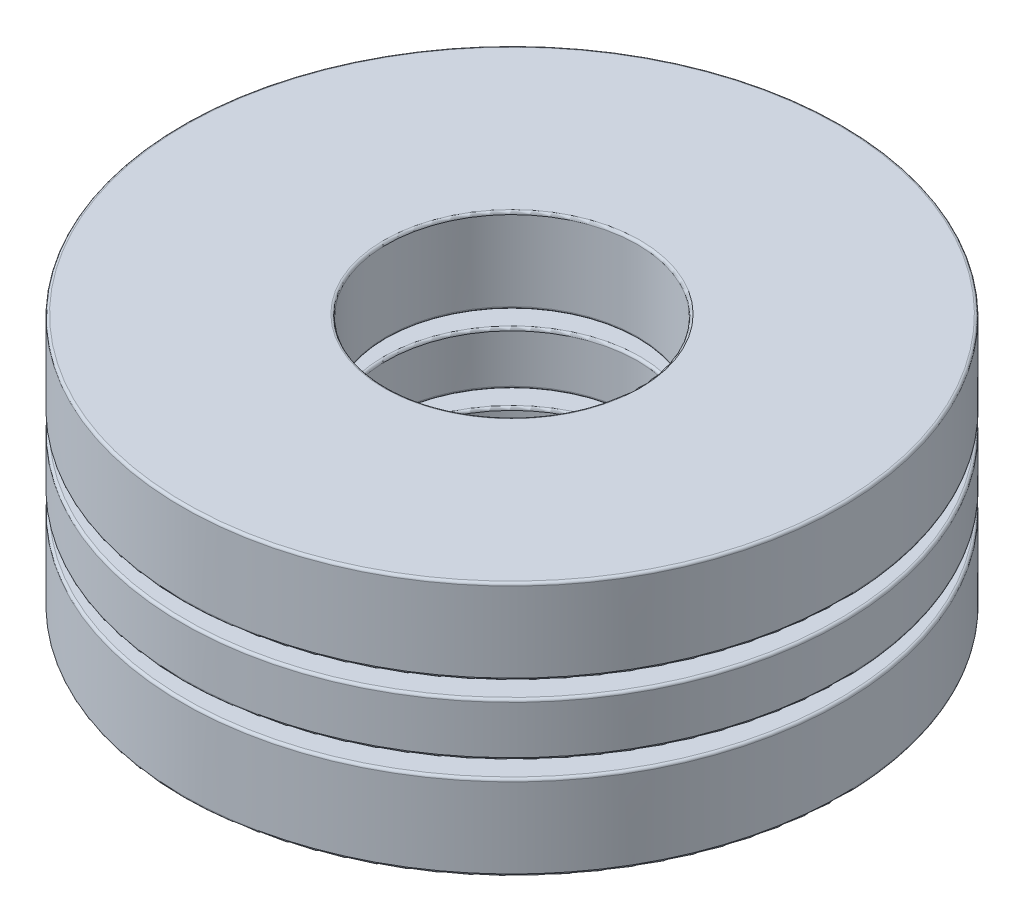
ISO-10303-21;
HEADER;
FILE_DESCRIPTION(('STEP AP214'),'2;1');
FILE_NAME('part.step','',(''),(''),'','','');
FILE_SCHEMA(('AUTOMOTIVE_DESIGN { 1 0 10303 214 1 1 1 1 }'));
ENDSEC;
DATA;
#1=APPLICATION_CONTEXT('core data for automotive mechanical design processes');
#2=APPLICATION_PROTOCOL_DEFINITION('international standard','automotive_design',2000,#1);
#3=PRODUCT_CONTEXT('',#1,'mechanical');
#4=PRODUCT('Part','Part','',(#3));
#5=PRODUCT_RELATED_PRODUCT_CATEGORY('part','',(#4));
#6=PRODUCT_DEFINITION_FORMATION('','',#4);
#7=PRODUCT_DEFINITION_CONTEXT('part definition',#1,'design');
#8=PRODUCT_DEFINITION('design','',#6,#7);
#9=PRODUCT_DEFINITION_SHAPE('','',#8);
#10=(LENGTH_UNIT() NAMED_UNIT(*) SI_UNIT(.MILLI.,.METRE.));
#11=(NAMED_UNIT(*) PLANE_ANGLE_UNIT() SI_UNIT($,.RADIAN.));
#12=(NAMED_UNIT(*) SI_UNIT($,.STERADIAN.) SOLID_ANGLE_UNIT());
#13=UNCERTAINTY_MEASURE_WITH_UNIT(LENGTH_MEASURE(1.E-05),#10,'distance_accuracy_value','');
#14=(GEOMETRIC_REPRESENTATION_CONTEXT(3) GLOBAL_UNCERTAINTY_ASSIGNED_CONTEXT((#13)) GLOBAL_UNIT_ASSIGNED_CONTEXT((#10,
#11,#12)) REPRESENTATION_CONTEXT('',''));
#15=CARTESIAN_POINT('',(0.,0.,0.));
#16=DIRECTION('',(0.,0.,1.));
#17=DIRECTION('',(1.,0.,0.));
#18=AXIS2_PLACEMENT_3D('',#15,#16,#17);
#19=CARTESIAN_POINT('',(0.,-2.4511,0.));
#20=DIRECTION('',(0.,-1.,0.));
#21=DIRECTION('',(0.,0.,-1.));
#22=AXIS2_PLACEMENT_3D('',#19,#20,#21);
#23=CYLINDRICAL_SURFACE('',#22,6.35);
#24=CARTESIAN_POINT('',(0.,-2.402078,0.));
#25=DIRECTION('',(0.,1.,0.));
#26=DIRECTION('',(0.,0.,1.));
#27=AXIS2_PLACEMENT_3D('',#24,#25,#26);
#28=CIRCLE('',#27,6.35);
#29=CARTESIAN_POINT('',(0.,-2.402078,6.35));
#30=VERTEX_POINT('',#29);
#31=EDGE_CURVE('E11',#30,#30,#28,.T.);
#32=ORIENTED_EDGE('',*,*,#31,.T.);
#33=EDGE_LOOP('',(#32));
#34=FACE_BOUND('',#33,.T.);
#35=CARTESIAN_POINT('',(0.,-0.866055333333333,0.));
#36=DIRECTION('',(0.,-1.,0.));
#37=DIRECTION('',(0.,0.,-1.));
#38=AXIS2_PLACEMENT_3D('',#35,#36,#37);
#39=CIRCLE('',#38,6.35);
#40=CARTESIAN_POINT('',(0.,-0.866055333333333,-6.35));
#41=VERTEX_POINT('',#40);
#42=EDGE_CURVE('E48',#41,#41,#39,.T.);
#43=ORIENTED_EDGE('',*,*,#42,.T.);
#44=EDGE_LOOP('',(#43));
#45=FACE_BOUND('',#44,.T.);
#46=ADVANCED_FACE('F41',(#34,#45),#23,.T.);
#47=CARTESIAN_POINT('',(0.,-0.817033333333333,6.35));
#48=DIRECTION('',(0.,-1.,0.));
#49=DIRECTION('',(0.,0.,-1.));
#50=AXIS2_PLACEMENT_3D('',#47,#48,#49);
#51=PLANE('',#50);
#52=CARTESIAN_POINT('',(0.,-0.817033333333333,0.));
#53=DIRECTION('',(0.,-1.,0.));
#54=DIRECTION('',(0.,0.,-1.));
#55=AXIS2_PLACEMENT_3D('',#52,#53,#54);
#56=CIRCLE('',#55,2.468372);
#57=CARTESIAN_POINT('',(0.,-0.817033333333333,-2.468372));
#58=VERTEX_POINT('',#57);
#59=EDGE_CURVE('E52',#58,#58,#56,.T.);
#60=ORIENTED_EDGE('',*,*,#59,.T.);
#61=EDGE_LOOP('',(#60));
#62=FACE_BOUND('',#61,.T.);
#63=CARTESIAN_POINT('',(0.,-0.817033333333333,0.));
#64=DIRECTION('',(0.,-1.,0.));
#65=DIRECTION('',(0.,0.,-1.));
#66=AXIS2_PLACEMENT_3D('',#63,#64,#65);
#67=CIRCLE('',#66,6.300978);
#68=CARTESIAN_POINT('',(0.,-0.817033333333333,-6.300978));
#69=VERTEX_POINT('',#68);
#70=EDGE_CURVE('E56',#69,#69,#67,.F.);
#71=ORIENTED_EDGE('',*,*,#70,.T.);
#72=EDGE_LOOP('',(#71));
#73=FACE_BOUND('',#72,.T.);
#74=ADVANCED_FACE('F84',(#62,#73),#51,.F.);
#75=CARTESIAN_POINT('',(0.,-2.4511,0.));
#76=DIRECTION('',(0.,-1.,0.));
#77=DIRECTION('',(0.,0.,-1.));
#78=AXIS2_PLACEMENT_3D('',#75,#76,#77);
#79=CYLINDRICAL_SURFACE('',#78,2.41935);
#80=CARTESIAN_POINT('',(0.,-2.402078,0.));
#81=DIRECTION('',(0.,1.,0.));
#82=DIRECTION('',(0.,0.,1.));
#83=AXIS2_PLACEMENT_3D('',#80,#81,#82);
#84=CIRCLE('',#83,2.41935);
#85=CARTESIAN_POINT('',(0.,-2.402078,2.41935));
#86=VERTEX_POINT('',#85);
#87=EDGE_CURVE('E67',#86,#86,#84,.F.);
#88=ORIENTED_EDGE('',*,*,#87,.T.);
#89=EDGE_LOOP('',(#88));
#90=FACE_BOUND('',#89,.T.);
#91=CARTESIAN_POINT('',(0.,-0.866055333333333,0.));
#92=DIRECTION('',(0.,-1.,0.));
#93=DIRECTION('',(0.,0.,-1.));
#94=AXIS2_PLACEMENT_3D('',#91,#92,#93);
#95=CIRCLE('',#94,2.41935);
#96=CARTESIAN_POINT('',(0.,-0.866055333333333,-2.41935));
#97=VERTEX_POINT('',#96);
#98=EDGE_CURVE('E70',#97,#97,#95,.F.);
#99=ORIENTED_EDGE('',*,*,#98,.T.);
#100=EDGE_LOOP('',(#99));
#101=FACE_BOUND('',#100,.T.);
#102=ADVANCED_FACE('F74',(#90,#101),#79,.F.);
#103=CARTESIAN_POINT('',(0.,-2.4511,6.35));
#104=DIRECTION('',(0.,1.,0.));
#105=DIRECTION('',(0.,0.,1.));
#106=AXIS2_PLACEMENT_3D('',#103,#104,#105);
#107=PLANE('',#106);
#108=CARTESIAN_POINT('',(0.,-2.4511,0.));
#109=DIRECTION('',(0.,1.,0.));
#110=DIRECTION('',(0.,0.,1.));
#111=AXIS2_PLACEMENT_3D('',#108,#109,#110);
#112=CIRCLE('',#111,2.468372);
#113=CARTESIAN_POINT('',(0.,-2.4511,2.468372));
#114=VERTEX_POINT('',#113);
#115=EDGE_CURVE('E61',#114,#114,#112,.T.);
#116=ORIENTED_EDGE('',*,*,#115,.T.);
#117=EDGE_LOOP('',(#116));
#118=FACE_BOUND('',#117,.T.);
#119=CARTESIAN_POINT('',(0.,-2.4511,0.));
#120=DIRECTION('',(0.,1.,0.));
#121=DIRECTION('',(0.,0.,1.));
#122=AXIS2_PLACEMENT_3D('',#119,#120,#121);
#123=CIRCLE('',#122,6.300978);
#124=CARTESIAN_POINT('',(0.,-2.4511,6.300978));
#125=VERTEX_POINT('',#124);
#126=EDGE_CURVE('E64',#125,#125,#123,.F.);
#127=ORIENTED_EDGE('',*,*,#126,.T.);
#128=EDGE_LOOP('',(#127));
#129=FACE_BOUND('',#128,.T.);
#130=ADVANCED_FACE('F103',(#118,#129),#107,.F.);
#131=CARTESIAN_POINT('',(0.,-2.402078,0.));
#132=DIRECTION('',(0.,1.,0.));
#133=DIRECTION('',(0.,0.,1.));
#134=AXIS2_PLACEMENT_3D('',#131,#132,#133);
#135=TOROIDAL_SURFACE('',#134,2.468372,0.049022);
#136=ORIENTED_EDGE('',*,*,#115,.F.);
#137=EDGE_LOOP('',(#136));
#138=FACE_BOUND('',#137,.T.);
#139=ORIENTED_EDGE('',*,*,#87,.F.);
#140=EDGE_LOOP('',(#139));
#141=FACE_BOUND('',#140,.T.);
#142=ADVANCED_FACE('F80',(#138,#141),#135,.T.);
#143=CARTESIAN_POINT('',(0.,-0.866055333333333,0.));
#144=DIRECTION('',(0.,-1.,0.));
#145=DIRECTION('',(0.,0.,-1.));
#146=AXIS2_PLACEMENT_3D('',#143,#144,#145);
#147=TOROIDAL_SURFACE('',#146,2.468372,0.049022);
#148=ORIENTED_EDGE('',*,*,#98,.F.);
#149=EDGE_LOOP('',(#148));
#150=FACE_BOUND('',#149,.T.);
#151=ORIENTED_EDGE('',*,*,#59,.F.);
#152=EDGE_LOOP('',(#151));
#153=FACE_BOUND('',#152,.T.);
#154=ADVANCED_FACE('F76',(#150,#153),#147,.T.);
#155=CARTESIAN_POINT('',(0.,-2.402078,0.));
#156=DIRECTION('',(0.,1.,0.));
#157=DIRECTION('',(0.,0.,1.));
#158=AXIS2_PLACEMENT_3D('',#155,#156,#157);
#159=TOROIDAL_SURFACE('',#158,6.300978,0.049022);
#160=ORIENTED_EDGE('',*,*,#31,.F.);
#161=EDGE_LOOP('',(#160));
#162=FACE_BOUND('',#161,.T.);
#163=ORIENTED_EDGE('',*,*,#126,.F.);
#164=EDGE_LOOP('',(#163));
#165=FACE_BOUND('',#164,.T.);
#166=ADVANCED_FACE('F79',(#162,#165),#159,.T.);
#167=CARTESIAN_POINT('',(0.,-0.866055333333333,0.));
#168=DIRECTION('',(0.,-1.,0.));
#169=DIRECTION('',(0.,0.,-1.));
#170=AXIS2_PLACEMENT_3D('',#167,#168,#169);
#171=TOROIDAL_SURFACE('',#170,6.300978,0.049022);
#172=ORIENTED_EDGE('',*,*,#70,.F.);
#173=EDGE_LOOP('',(#172));
#174=FACE_BOUND('',#173,.T.);
#175=ORIENTED_EDGE('',*,*,#42,.F.);
#176=EDGE_LOOP('',(#175));
#177=FACE_BOUND('',#176,.T.);
#178=ADVANCED_FACE('F43',(#174,#177),#171,.T.);
#179=CLOSED_SHELL('',(#46,#74,#102,#130,#142,#154,#166,#178));
#180=MANIFOLD_SOLID_BREP('B2',#179);
#181=CARTESIAN_POINT('',(0.,-2.4511,0.));
#182=DIRECTION('',(0.,-1.,0.));
#183=DIRECTION('',(0.,0.,-1.));
#184=AXIS2_PLACEMENT_3D('',#181,#182,#183);
#185=CYLINDRICAL_SURFACE('',#184,6.35);
#186=CARTESIAN_POINT('',(0.,0.866055333333334,0.));
#187=DIRECTION('',(0.,1.,0.));
#188=DIRECTION('',(0.,0.,1.));
#189=AXIS2_PLACEMENT_3D('',#186,#187,#188);
#190=CIRCLE('',#189,6.35);
#191=CARTESIAN_POINT('',(0.,0.866055333333334,6.35));
#192=VERTEX_POINT('',#191);
#193=EDGE_CURVE('E40',#192,#192,#190,.T.);
#194=ORIENTED_EDGE('',*,*,#193,.T.);
#195=EDGE_LOOP('',(#194));
#196=FACE_BOUND('',#195,.T.);
#197=CARTESIAN_POINT('',(0.,2.402078,0.));
#198=DIRECTION('',(0.,-1.,0.));
#199=DIRECTION('',(0.,0.,-1.));
#200=AXIS2_PLACEMENT_3D('',#197,#198,#199);
#201=CIRCLE('',#200,6.35);
#202=CARTESIAN_POINT('',(0.,2.402078,-6.35));
#203=VERTEX_POINT('',#202);
#204=EDGE_CURVE('E175',#203,#203,#201,.T.);
#205=ORIENTED_EDGE('',*,*,#204,.T.);
#206=EDGE_LOOP('',(#205));
#207=FACE_BOUND('',#206,.T.);
#208=ADVANCED_FACE('F168',(#196,#207),#185,.T.);
#209=CARTESIAN_POINT('',(0.,2.4511,6.35));
#210=DIRECTION('',(0.,-1.,0.));
#211=DIRECTION('',(0.,0.,-1.));
#212=AXIS2_PLACEMENT_3D('',#209,#210,#211);
#213=PLANE('',#212);
#214=CARTESIAN_POINT('',(0.,2.4511,0.));
#215=DIRECTION('',(0.,-1.,0.));
#216=DIRECTION('',(0.,0.,-1.));
#217=AXIS2_PLACEMENT_3D('',#214,#215,#216);
#218=CIRCLE('',#217,2.468372);
#219=CARTESIAN_POINT('',(0.,2.4511,-2.468372));
#220=VERTEX_POINT('',#219);
#221=EDGE_CURVE('E179',#220,#220,#218,.T.);
#222=ORIENTED_EDGE('',*,*,#221,.T.);
#223=EDGE_LOOP('',(#222));
#224=FACE_BOUND('',#223,.T.);
#225=CARTESIAN_POINT('',(0.,2.4511,0.));
#226=DIRECTION('',(0.,-1.,0.));
#227=DIRECTION('',(0.,0.,-1.));
#228=AXIS2_PLACEMENT_3D('',#225,#226,#227);
#229=CIRCLE('',#228,6.300978);
#230=CARTESIAN_POINT('',(0.,2.4511,-6.300978));
#231=VERTEX_POINT('',#230);
#232=EDGE_CURVE('E183',#231,#231,#229,.F.);
#233=ORIENTED_EDGE('',*,*,#232,.T.);
#234=EDGE_LOOP('',(#233));
#235=FACE_BOUND('',#234,.T.);
#236=ADVANCED_FACE('F211',(#224,#235),#213,.F.);
#237=CARTESIAN_POINT('',(0.,-2.4511,0.));
#238=DIRECTION('',(0.,-1.,0.));
#239=DIRECTION('',(0.,0.,-1.));
#240=AXIS2_PLACEMENT_3D('',#237,#238,#239);
#241=CYLINDRICAL_SURFACE('',#240,2.41935);
#242=CARTESIAN_POINT('',(0.,0.866055333333334,0.));
#243=DIRECTION('',(0.,1.,0.));
#244=DIRECTION('',(0.,0.,1.));
#245=AXIS2_PLACEMENT_3D('',#242,#243,#244);
#246=CIRCLE('',#245,2.41935);
#247=CARTESIAN_POINT('',(0.,0.866055333333334,2.41935));
#248=VERTEX_POINT('',#247);
#249=EDGE_CURVE('E194',#248,#248,#246,.F.);
#250=ORIENTED_EDGE('',*,*,#249,.T.);
#251=EDGE_LOOP('',(#250));
#252=FACE_BOUND('',#251,.T.);
#253=CARTESIAN_POINT('',(0.,2.402078,0.));
#254=DIRECTION('',(0.,-1.,0.));
#255=DIRECTION('',(0.,0.,-1.));
#256=AXIS2_PLACEMENT_3D('',#253,#254,#255);
#257=CIRCLE('',#256,2.41935);
#258=CARTESIAN_POINT('',(0.,2.402078,-2.41935));
#259=VERTEX_POINT('',#258);
#260=EDGE_CURVE('E197',#259,#259,#257,.F.);
#261=ORIENTED_EDGE('',*,*,#260,.T.);
#262=EDGE_LOOP('',(#261));
#263=FACE_BOUND('',#262,.T.);
#264=ADVANCED_FACE('F201',(#252,#263),#241,.F.);
#265=CARTESIAN_POINT('',(0.,0.817033333333334,6.35));
#266=DIRECTION('',(0.,1.,0.));
#267=DIRECTION('',(0.,0.,1.));
#268=AXIS2_PLACEMENT_3D('',#265,#266,#267);
#269=PLANE('',#268);
#270=CARTESIAN_POINT('',(0.,0.817033333333334,0.));
#271=DIRECTION('',(0.,1.,0.));
#272=DIRECTION('',(0.,0.,1.));
#273=AXIS2_PLACEMENT_3D('',#270,#271,#272);
#274=CIRCLE('',#273,2.468372);
#275=CARTESIAN_POINT('',(0.,0.817033333333334,2.468372));
#276=VERTEX_POINT('',#275);
#277=EDGE_CURVE('E188',#276,#276,#274,.T.);
#278=ORIENTED_EDGE('',*,*,#277,.T.);
#279=EDGE_LOOP('',(#278));
#280=FACE_BOUND('',#279,.T.);
#281=CARTESIAN_POINT('',(0.,0.817033333333334,0.));
#282=DIRECTION('',(0.,1.,0.));
#283=DIRECTION('',(0.,0.,1.));
#284=AXIS2_PLACEMENT_3D('',#281,#282,#283);
#285=CIRCLE('',#284,6.300978);
#286=CARTESIAN_POINT('',(0.,0.817033333333334,6.300978));
#287=VERTEX_POINT('',#286);
#288=EDGE_CURVE('E191',#287,#287,#285,.F.);
#289=ORIENTED_EDGE('',*,*,#288,.T.);
#290=EDGE_LOOP('',(#289));
#291=FACE_BOUND('',#290,.T.);
#292=ADVANCED_FACE('F230',(#280,#291),#269,.F.);
#293=CARTESIAN_POINT('',(0.,0.866055333333334,0.));
#294=DIRECTION('',(0.,1.,0.));
#295=DIRECTION('',(0.,0.,1.));
#296=AXIS2_PLACEMENT_3D('',#293,#294,#295);
#297=TOROIDAL_SURFACE('',#296,2.468372,0.049022);
#298=ORIENTED_EDGE('',*,*,#277,.F.);
#299=EDGE_LOOP('',(#298));
#300=FACE_BOUND('',#299,.T.);
#301=ORIENTED_EDGE('',*,*,#249,.F.);
#302=EDGE_LOOP('',(#301));
#303=FACE_BOUND('',#302,.T.);
#304=ADVANCED_FACE('F207',(#300,#303),#297,.T.);
#305=CARTESIAN_POINT('',(0.,2.402078,0.));
#306=DIRECTION('',(0.,-1.,0.));
#307=DIRECTION('',(0.,0.,-1.));
#308=AXIS2_PLACEMENT_3D('',#305,#306,#307);
#309=TOROIDAL_SURFACE('',#308,2.468372,0.049022);
#310=ORIENTED_EDGE('',*,*,#260,.F.);
#311=EDGE_LOOP('',(#310));
#312=FACE_BOUND('',#311,.T.);
#313=ORIENTED_EDGE('',*,*,#221,.F.);
#314=EDGE_LOOP('',(#313));
#315=FACE_BOUND('',#314,.T.);
#316=ADVANCED_FACE('F203',(#312,#315),#309,.T.);
#317=CARTESIAN_POINT('',(0.,0.866055333333334,0.));
#318=DIRECTION('',(0.,1.,0.));
#319=DIRECTION('',(0.,0.,1.));
#320=AXIS2_PLACEMENT_3D('',#317,#318,#319);
#321=TOROIDAL_SURFACE('',#320,6.300978,0.049022);
#322=ORIENTED_EDGE('',*,*,#193,.F.);
#323=EDGE_LOOP('',(#322));
#324=FACE_BOUND('',#323,.T.);
#325=ORIENTED_EDGE('',*,*,#288,.F.);
#326=EDGE_LOOP('',(#325));
#327=FACE_BOUND('',#326,.T.);
#328=ADVANCED_FACE('F206',(#324,#327),#321,.T.);
#329=CARTESIAN_POINT('',(0.,2.402078,0.));
#330=DIRECTION('',(0.,-1.,0.));
#331=DIRECTION('',(0.,0.,-1.));
#332=AXIS2_PLACEMENT_3D('',#329,#330,#331);
#333=TOROIDAL_SURFACE('',#332,6.300978,0.049022);
#334=ORIENTED_EDGE('',*,*,#232,.F.);
#335=EDGE_LOOP('',(#334));
#336=FACE_BOUND('',#335,.T.);
#337=ORIENTED_EDGE('',*,*,#204,.F.);
#338=EDGE_LOOP('',(#337));
#339=FACE_BOUND('',#338,.T.);
#340=ADVANCED_FACE('F170',(#336,#339),#333,.T.);
#341=CLOSED_SHELL('',(#208,#236,#264,#292,#304,#316,#328,#340));
#342=MANIFOLD_SOLID_BREP('B6',#341);
#343=CARTESIAN_POINT('',(-3.79723993733855,0.,-2.19233749999996));
#344=DIRECTION('',(0.,1.,0.));
#345=DIRECTION('',(0.866025403784443,0.,0.499999999999992));
#346=AXIS2_PLACEMENT_3D('',#343,#344,#345);
#347=SPHERICAL_SURFACE('',#346,0.817033333333333);
#348=CARTESIAN_POINT('',(-3.79723993733855,0.817033333333333,-2.19233749999996));
#349=VERTEX_POINT('',#348);
#350=VERTEX_LOOP('',#349);
#351=FACE_BOUND('',#350,.T.);
#352=ADVANCED_FACE('F295',(#351),#347,.T.);
#353=CLOSED_SHELL('',(#352));
#354=MANIFOLD_SOLID_BREP('B35',#353);
#355=CARTESIAN_POINT('',(3.79723993733852,0.,-2.19233750000002));
#356=DIRECTION('',(0.,1.,0.));
#357=DIRECTION('',(-0.866025403784436,0.,0.500000000000004));
#358=AXIS2_PLACEMENT_3D('',#355,#356,#357);
#359=SPHERICAL_SURFACE('',#358,0.817033333333333);
#360=CARTESIAN_POINT('',(3.79723993733852,0.817033333333333,-2.19233750000002));
#361=VERTEX_POINT('',#360);
#362=VERTEX_LOOP('',#361);
#363=FACE_BOUND('',#362,.T.);
#364=ADVANCED_FACE('F313',(#363),#359,.T.);
#365=CLOSED_SHELL('',(#364));
#366=MANIFOLD_SOLID_BREP('B164',#365);
#367=CARTESIAN_POINT('',(0.,0.,4.384675));
#368=DIRECTION('',(0.,1.,0.));
#369=DIRECTION('',(0.,0.,-1.));
#370=AXIS2_PLACEMENT_3D('',#367,#368,#369);
#371=SPHERICAL_SURFACE('',#370,0.817033333333333);
#372=CARTESIAN_POINT('',(0.,0.817033333333333,4.384675));
#373=VERTEX_POINT('',#372);
#374=VERTEX_LOOP('',#373);
#375=FACE_BOUND('',#374,.T.);
#376=ADVANCED_FACE('F332',(#375),#371,.T.);
#377=CLOSED_SHELL('',(#376));
#378=MANIFOLD_SOLID_BREP('B291',#377);
#379=CARTESIAN_POINT('',(0.,-2.4511,0.));
#380=DIRECTION('',(0.,-1.,0.));
#381=DIRECTION('',(0.,0.,-1.));
#382=AXIS2_PLACEMENT_3D('',#379,#380,#381);
#383=CYLINDRICAL_SURFACE('',#382,6.35);
#384=CARTESIAN_POINT('',(0.,-0.461623833333335,0.));
#385=DIRECTION('',(0.,1.,0.));
#386=DIRECTION('',(0.,0.,1.));
#387=AXIS2_PLACEMENT_3D('',#384,#385,#386);
#388=CIRCLE('',#387,6.35);
#389=CARTESIAN_POINT('',(0.,-0.461623833333335,6.35));
#390=VERTEX_POINT('',#389);
#391=EDGE_CURVE('E331',#390,#390,#388,.T.);
#392=ORIENTED_EDGE('',*,*,#391,.T.);
#393=EDGE_LOOP('',(#392));
#394=FACE_BOUND('',#393,.T.);
#395=CARTESIAN_POINT('',(0.,0.461623833333332,0.));
#396=DIRECTION('',(0.,-1.,0.));
#397=DIRECTION('',(0.,0.,-1.));
#398=AXIS2_PLACEMENT_3D('',#395,#396,#397);
#399=CIRCLE('',#398,6.35);
#400=CARTESIAN_POINT('',(0.,0.461623833333332,-6.35));
#401=VERTEX_POINT('',#400);
#402=EDGE_CURVE('E351',#401,#401,#399,.T.);
#403=ORIENTED_EDGE('',*,*,#402,.T.);
#404=EDGE_LOOP('',(#403));
#405=FACE_BOUND('',#404,.T.);
#406=ADVANCED_FACE('F344',(#394,#405),#383,.T.);
#407=CARTESIAN_POINT('',(0.,-0.510645833333335,6.35));
#408=DIRECTION('',(0.,1.,0.));
#409=DIRECTION('',(0.,0.,1.));
#410=AXIS2_PLACEMENT_3D('',#407,#408,#409);
#411=PLANE('',#410);
#412=CARTESIAN_POINT('',(0.,-0.510645833333335,0.));
#413=DIRECTION('',(0.,1.,0.));
#414=DIRECTION('',(0.,0.,1.));
#415=AXIS2_PLACEMENT_3D('',#412,#413,#414);
#416=CIRCLE('',#415,2.468372);
#417=CARTESIAN_POINT('',(0.,-0.510645833333335,2.468372));
#418=VERTEX_POINT('',#417);
#419=EDGE_CURVE('E364',#418,#418,#416,.T.);
#420=ORIENTED_EDGE('',*,*,#419,.T.);
#421=EDGE_LOOP('',(#420));
#422=FACE_BOUND('',#421,.T.);
#423=CARTESIAN_POINT('',(0.,-0.510645833333335,0.));
#424=DIRECTION('',(0.,1.,0.));
#425=DIRECTION('',(0.,0.,1.));
#426=AXIS2_PLACEMENT_3D('',#423,#424,#425);
#427=CIRCLE('',#426,6.300978);
#428=CARTESIAN_POINT('',(0.,-0.510645833333335,6.300978));
#429=VERTEX_POINT('',#428);
#430=EDGE_CURVE('E367',#429,#429,#427,.F.);
#431=ORIENTED_EDGE('',*,*,#430,.T.);
#432=EDGE_LOOP('',(#431));
#433=FACE_BOUND('',#432,.T.);
#434=CARTESIAN_POINT('',(-3.79723993733855,-0.510645833333335,-2.19233749999996));
#435=DIRECTION('',(0.,1.,0.));
#436=DIRECTION('',(-0.866025403784443,0.,-0.499999999999992));
#437=AXIS2_PLACEMENT_3D('',#434,#435,#436);
#438=CIRCLE('',#437,0.637796441411429);
#439=CARTESIAN_POINT('',(-3.24489201663294,-0.510645833333335,-1.87343927929426));
#440=VERTEX_POINT('',#439);
#441=EDGE_CURVE('E388',#440,#440,#438,.T.);
#442=ORIENTED_EDGE('',*,*,#441,.T.);
#443=EDGE_LOOP('',(#442));
#444=FACE_BOUND('',#443,.T.);
#445=CARTESIAN_POINT('',(3.79723993733852,-0.510645833333335,-2.19233750000002));
#446=DIRECTION('',(0.,1.,0.));
#447=DIRECTION('',(0.866025403784436,0.,-0.500000000000004));
#448=AXIS2_PLACEMENT_3D('',#445,#446,#447);
#449=CIRCLE('',#448,0.637796441411429);
#450=CARTESIAN_POINT('',(3.24489201663291,-0.510645833333335,-1.8734392792943));
#451=VERTEX_POINT('',#450);
#452=EDGE_CURVE('E380',#451,#451,#449,.T.);
#453=ORIENTED_EDGE('',*,*,#452,.T.);
#454=EDGE_LOOP('',(#453));
#455=FACE_BOUND('',#454,.T.);
#456=CARTESIAN_POINT('',(0.,-0.510645833333335,4.384675));
#457=DIRECTION('',(0.,1.,0.));
#458=DIRECTION('',(0.,0.,1.));
#459=AXIS2_PLACEMENT_3D('',#456,#457,#458);
#460=CIRCLE('',#459,0.637796441411429);
#461=CARTESIAN_POINT('',(0.,-0.510645833333335,3.74687855858857));
#462=VERTEX_POINT('',#461);
#463=EDGE_CURVE('E376',#462,#462,#460,.T.);
#464=ORIENTED_EDGE('',*,*,#463,.T.);
#465=EDGE_LOOP('',(#464));
#466=FACE_BOUND('',#465,.T.);
#467=ADVANCED_FACE('F406',(#422,#433,#444,#455,#466),#411,.F.);
#468=CARTESIAN_POINT('',(0.,-2.4511,0.));
#469=DIRECTION('',(0.,-1.,0.));
#470=DIRECTION('',(0.,0.,-1.));
#471=AXIS2_PLACEMENT_3D('',#468,#469,#470);
#472=CYLINDRICAL_SURFACE('',#471,2.41935);
#473=CARTESIAN_POINT('',(0.,-0.461623833333335,0.));
#474=DIRECTION('',(0.,1.,0.));
#475=DIRECTION('',(0.,0.,1.));
#476=AXIS2_PLACEMENT_3D('',#473,#474,#475);
#477=CIRCLE('',#476,2.41935);
#478=CARTESIAN_POINT('',(0.,-0.461623833333335,2.41935));
#479=VERTEX_POINT('',#478);
#480=EDGE_CURVE('E370',#479,#479,#477,.F.);
#481=ORIENTED_EDGE('',*,*,#480,.T.);
#482=EDGE_LOOP('',(#481));
#483=FACE_BOUND('',#482,.T.);
#484=CARTESIAN_POINT('',(0.,0.461623833333332,0.));
#485=DIRECTION('',(0.,-1.,0.));
#486=DIRECTION('',(0.,0.,-1.));
#487=AXIS2_PLACEMENT_3D('',#484,#485,#486);
#488=CIRCLE('',#487,2.41935);
#489=CARTESIAN_POINT('',(0.,0.461623833333332,-2.41935));
#490=VERTEX_POINT('',#489);
#491=EDGE_CURVE('E373',#490,#490,#488,.F.);
#492=ORIENTED_EDGE('',*,*,#491,.T.);
#493=EDGE_LOOP('',(#492));
#494=FACE_BOUND('',#493,.T.);
#495=ADVANCED_FACE('F409',(#483,#494),#472,.F.);
#496=CARTESIAN_POINT('',(0.,0.510645833333332,6.35));
#497=DIRECTION('',(0.,-1.,0.));
#498=DIRECTION('',(0.,0.,-1.));
#499=AXIS2_PLACEMENT_3D('',#496,#497,#498);
#500=PLANE('',#499);
#501=CARTESIAN_POINT('',(0.,0.510645833333332,0.));
#502=DIRECTION('',(0.,-1.,0.));
#503=DIRECTION('',(0.,0.,-1.));
#504=AXIS2_PLACEMENT_3D('',#501,#502,#503);
#505=CIRCLE('',#504,2.468372);
#506=CARTESIAN_POINT('',(0.,0.510645833333332,-2.468372));
#507=VERTEX_POINT('',#506);
#508=EDGE_CURVE('E355',#507,#507,#505,.T.);
#509=ORIENTED_EDGE('',*,*,#508,.T.);
#510=EDGE_LOOP('',(#509));
#511=FACE_BOUND('',#510,.T.);
#512=CARTESIAN_POINT('',(0.,0.510645833333332,0.));
#513=DIRECTION('',(0.,-1.,0.));
#514=DIRECTION('',(0.,0.,-1.));
#515=AXIS2_PLACEMENT_3D('',#512,#513,#514);
#516=CIRCLE('',#515,6.300978);
#517=CARTESIAN_POINT('',(0.,0.510645833333332,-6.300978));
#518=VERTEX_POINT('',#517);
#519=EDGE_CURVE('E359',#518,#518,#516,.F.);
#520=ORIENTED_EDGE('',*,*,#519,.T.);
#521=EDGE_LOOP('',(#520));
#522=FACE_BOUND('',#521,.T.);
#523=CARTESIAN_POINT('',(-3.79723993733855,0.510645833333332,-2.19233749999996));
#524=DIRECTION('',(0.,-1.,0.));
#525=DIRECTION('',(0.866025403784443,0.,0.499999999999992));
#526=AXIS2_PLACEMENT_3D('',#523,#524,#525);
#527=CIRCLE('',#526,0.637796441411431);
#528=CARTESIAN_POINT('',(-3.24489201663294,0.510645833333332,-1.87343927929425));
#529=VERTEX_POINT('',#528);
#530=EDGE_CURVE('E391',#529,#529,#527,.T.);
#531=ORIENTED_EDGE('',*,*,#530,.T.);
#532=EDGE_LOOP('',(#531));
#533=FACE_BOUND('',#532,.T.);
#534=CARTESIAN_POINT('',(3.79723993733852,0.510645833333332,-2.19233750000002));
#535=DIRECTION('',(0.,-1.,0.));
#536=DIRECTION('',(-0.866025403784436,0.,0.500000000000004));
#537=AXIS2_PLACEMENT_3D('',#534,#535,#536);
#538=CIRCLE('',#537,0.637796441411431);
#539=CARTESIAN_POINT('',(3.24489201663291,0.510645833333332,-1.8734392792943));
#540=VERTEX_POINT('',#539);
#541=EDGE_CURVE('E385',#540,#540,#538,.T.);
#542=ORIENTED_EDGE('',*,*,#541,.T.);
#543=EDGE_LOOP('',(#542));
#544=FACE_BOUND('',#543,.T.);
#545=CARTESIAN_POINT('',(0.,0.510645833333332,4.384675));
#546=DIRECTION('',(0.,-1.,0.));
#547=DIRECTION('',(0.,0.,-1.));
#548=AXIS2_PLACEMENT_3D('',#545,#546,#547);
#549=CIRCLE('',#548,0.637796441411431);
#550=CARTESIAN_POINT('',(0.,0.510645833333332,3.74687855858857));
#551=VERTEX_POINT('',#550);
#552=EDGE_CURVE('E377',#551,#551,#549,.T.);
#553=ORIENTED_EDGE('',*,*,#552,.T.);
#554=EDGE_LOOP('',(#553));
#555=FACE_BOUND('',#554,.T.);
#556=ADVANCED_FACE('F395',(#511,#522,#533,#544,#555),#500,.F.);
#557=CARTESIAN_POINT('',(0.,0.,4.384675));
#558=DIRECTION('',(0.,1.,0.));
#559=DIRECTION('',(0.,0.,-1.));
#560=AXIS2_PLACEMENT_3D('',#557,#558,#559);
#561=SPHERICAL_SURFACE('',#560,0.817033333333333);
#562=CARTESIAN_POINT('',(0.,0.510645833333332,3.74687855858857));
#563=CARTESIAN_POINT('',(0.,0.501675164998559,3.73969607738196));
#564=CARTESIAN_POINT('',(0.,0.492552783000895,3.73270310460206));
#565=CARTESIAN_POINT('',(0.,0.474021234127414,3.7191080760368));
#566=CARTESIAN_POINT('',(0.,0.464612067251597,3.71250602025143));
#567=CARTESIAN_POINT('',(0.,0.445523591069434,3.69970472581636));
#568=CARTESIAN_POINT('',(0.,0.435844281763088,3.69350548716665));
#569=CARTESIAN_POINT('',(0.,0.41623278087744,3.68152082357285));
#570=CARTESIAN_POINT('',(0.,0.406300589298138,3.67573539862875));
#571=CARTESIAN_POINT('',(0.,0.386200997553858,3.66458867230342));
#572=CARTESIAN_POINT('',(0.,0.376033597388881,3.65922737092218));
#573=CARTESIAN_POINT('',(0.,0.355481690704,3.64893843316086));
#574=CARTESIAN_POINT('',(0.,0.345097184184096,3.64401079678077));
#575=CARTESIAN_POINT('',(0.,0.324129550884321,3.63459796203054));
#576=CARTESIAN_POINT('',(0.,0.31354642410445,3.63011276366039));
#577=CARTESIAN_POINT('',(0.,0.292200390671569,3.62159278934294));
#578=CARTESIAN_POINT('',(0.,0.28143748401856,3.61755801339564));
#579=CARTESIAN_POINT('',(0.,0.259751051084057,3.60994606674576));
#580=CARTESIAN_POINT('',(0.,0.248827524802562,3.60636889604317));
#581=CARTESIAN_POINT('',(0.,0.226839298843794,3.59967852799998));
#582=CARTESIAN_POINT('',(0.,0.215774599166519,3.59656533065938));
#583=CARTESIAN_POINT('',(0.,0.193523723954283,3.5908084515037));
#584=CARTESIAN_POINT('',(0.,0.18233754841932,3.58816476968864));
#585=CARTESIAN_POINT('',(0.,0.159863635286543,3.58335162790421));
#586=CARTESIAN_POINT('',(0.,0.148575897688727,3.58118216793485));
#587=CARTESIAN_POINT('',(0.,0.125918955026379,3.57732133194664));
#588=CARTESIAN_POINT('',(0.,0.114549749961847,3.57562995592779));
#589=CARTESIAN_POINT('',(0.,0.0917501119920464,3.57272829885297));
#590=CARTESIAN_POINT('',(0.,0.0803196790867775,3.57151801779699));
#591=CARTESIAN_POINT('',(0.,0.057417934060114,3.56958070520805));
#592=CARTESIAN_POINT('',(0.,0.0459466219387196,3.56885367367509));
#593=CARTESIAN_POINT('',(0.,0.0229835398782163,3.5678841544044));
#594=CARTESIAN_POINT('',(0.,0.0114917699391074,3.56764166666667));
#595=CARTESIAN_POINT('',(0.,-0.0114917699391102,3.56764166666667));
#596=CARTESIAN_POINT('',(0.,-0.022983539878219,3.5678841544044));
#597=CARTESIAN_POINT('',(0.,-0.0459466219387223,3.56885367367509));
#598=CARTESIAN_POINT('',(0.,-0.0574179340601167,3.56958070520805));
#599=CARTESIAN_POINT('',(0.,-0.0803196790867802,3.57151801779699));
#600=CARTESIAN_POINT('',(0.,-0.0917501119920491,3.57272829885297));
#601=CARTESIAN_POINT('',(0.,-0.11454974996185,3.57562995592779));
#602=CARTESIAN_POINT('',(0.,-0.125918955026382,3.57732133194665));
#603=CARTESIAN_POINT('',(0.,-0.14857589768873,3.58118216793485));
#604=CARTESIAN_POINT('',(0.,-0.159863635286545,3.58335162790421));
#605=CARTESIAN_POINT('',(0.,-0.182337548419323,3.58816476968864));
#606=CARTESIAN_POINT('',(0.,-0.193523723954285,3.5908084515037));
#607=CARTESIAN_POINT('',(0.,-0.215774599166522,3.59656533065938));
#608=CARTESIAN_POINT('',(0.,-0.226839298843796,3.59967852799998));
#609=CARTESIAN_POINT('',(0.,-0.248827524802565,3.60636889604318));
#610=CARTESIAN_POINT('',(0.,-0.259751051084059,3.60994606674576));
#611=CARTESIAN_POINT('',(0.,-0.281437484018563,3.61755801339565));
#612=CARTESIAN_POINT('',(0.,-0.292200390671572,3.62159278934294));
#613=CARTESIAN_POINT('',(0.,-0.313546424104453,3.63011276366039));
#614=CARTESIAN_POINT('',(0.,-0.324129550884324,3.63459796203054));
#615=CARTESIAN_POINT('',(0.,-0.345097184184099,3.64401079678078));
#616=CARTESIAN_POINT('',(0.,-0.355481690704002,3.64893843316086));
#617=CARTESIAN_POINT('',(0.,-0.376033597388883,3.65922737092218));
#618=CARTESIAN_POINT('',(0.,-0.386200997553861,3.66458867230342));
#619=CARTESIAN_POINT('',(0.,-0.40630058929814,3.67573539862875));
#620=CARTESIAN_POINT('',(0.,-0.416232780877443,3.68152082357285));
#621=CARTESIAN_POINT('',(0.,-0.435844281763091,3.69350548716666));
#622=CARTESIAN_POINT('',(0.,-0.445523591069436,3.69970472581636));
#623=CARTESIAN_POINT('',(0.,-0.464612067251599,3.71250602025143));
#624=CARTESIAN_POINT('',(0.,-0.474021234127416,3.7191080760368));
#625=CARTESIAN_POINT('',(0.,-0.492552783000897,3.73270310460206));
#626=CARTESIAN_POINT('',(0.,-0.501675164998561,3.73969607738196));
#627=CARTESIAN_POINT('',(0.,-0.510645833333335,3.74687855858857));
#628=B_SPLINE_CURVE_WITH_KNOTS('',3,(#562,#563,#564,#565,#566,#567,#568,#569,#570,#571,#572,
#573,#574,#575,#576,#577,#578,#579,#580,#581,#582,#583,#584,#585,#586,#587,#588,#589,#590,#591,
#592,#593,#594,#595,#596,#597,#598,#599,#600,#601,#602,#603,#604,#605,#606,#607,#608,#609,#610,
#611,#612,#613,#614,#615,#616,#617,#618,#619,#620,#621,#622,#623,#624,#625,#626,#627),
.UNSPECIFIED.,.F.,.F.,(4,2,2,2,2,2,2,2,2,2,2,2,2,2,2,2,2,2,2,2,2,2,2,2,2,2,2,2,2,2,2,2,4),(0.,
0.0344727528748284,0.0689455057496566,0.103418258624485,0.137891011499313,0.172363764374141,
0.20683651724897,0.241309270123798,0.275782022998627,0.310254775873455,0.344727528748283,
0.379200281623111,0.41367303449794,0.448145787372768,0.482618540247596,0.517091293122425,
0.551564045997253,0.586036798872081,0.620509551746909,0.654982304621738,0.689455057496566,
0.723927810371394,0.758400563246223,0.792873316121051,0.827346068995879,0.861818821870707,
0.896291574745536,0.930764327620364,0.965237080495192,0.999709833370021,1.03418258624485,
1.06865533911968,1.10312809199451),.UNSPECIFIED.);
#629=EDGE_CURVE('BSEAM416',#551,#462,#628,.T.);
#630=ORIENTED_EDGE('',*,*,#552,.F.);
#631=ORIENTED_EDGE('',*,*,#463,.F.);
#632=ORIENTED_EDGE('',*,*,#629,.T.);
#633=ORIENTED_EDGE('',*,*,#629,.F.);
#634=EDGE_LOOP('',(#630,#632,#631,#633));
#635=FACE_BOUND('',#634,.T.);
#636=ADVANCED_FACE('F416',(#635),#561,.F.);
#637=CARTESIAN_POINT('',(3.79723993733852,0.,-2.19233750000002));
#638=DIRECTION('',(0.,1.,0.));
#639=DIRECTION('',(-0.866025403784436,0.,0.500000000000004));
#640=AXIS2_PLACEMENT_3D('',#637,#638,#639);
#641=SPHERICAL_SURFACE('',#640,0.817033333333333);
#642=CARTESIAN_POINT('',(3.24489201663291,0.510645833333332,-1.8734392792943));
#643=CARTESIAN_POINT('',(3.23867180544578,0.501675164998559,-1.869848038691));
#644=CARTESIAN_POINT('',(3.23261571337042,0.492552783000895,-1.86635155230105));
#645=CARTESIAN_POINT('',(3.22084207326773,0.474021234127414,-1.85955403801841));
#646=CARTESIAN_POINT('',(3.2151245252404,0.464612067251597,-1.85625301012573));
#647=CARTESIAN_POINT('',(3.2040382790583,0.445523591069434,-1.8498523629082));
#648=CARTESIAN_POINT('',(3.19866958090353,0.435844281763088,-1.84675274358334));
#649=CARTESIAN_POINT('',(3.18829055777549,0.41623278087744,-1.84076041178644));
#650=CARTESIAN_POINT('',(3.18328023280221,0.406300589298138,-1.83786769931439));
#651=CARTESIAN_POINT('',(3.17362688463544,0.386200997553858,-1.83229433615172));
#652=CARTESIAN_POINT('',(3.16898386144194,0.376033597388881,-1.8296136854611));
#653=CARTESIAN_POINT('',(3.16007337996268,0.355481690704,-1.82446921658044));
#654=CARTESIAN_POINT('',(3.15580592167692,0.345097184184096,-1.8220053983904));
#655=CARTESIAN_POINT('',(3.14765416766159,0.324129550884321,-1.81729898101529));
#656=CARTESIAN_POINT('',(3.14376987193203,0.31354642410445,-1.81505638183021));
#657=CARTESIAN_POINT('',(3.13639135773353,0.292200390671569,-1.81079639467149));
#658=CARTESIAN_POINT('',(3.13289713926459,0.28143748401856,-1.80877900669784));
#659=CARTESIAN_POINT('',(3.12630500009354,0.259751051084056,-1.8049730333729));
#660=CARTESIAN_POINT('',(3.12320707939142,0.248827524802562,-1.8031844480216));
#661=CARTESIAN_POINT('',(3.11741305070535,0.226839298843794,-1.79983926400001));
#662=CARTESIAN_POINT('',(3.11471694272139,0.215774599166519,-1.7982826653297));
#663=CARTESIAN_POINT('',(3.10973133912606,0.193523723954283,-1.79540422575187));
#664=CARTESIAN_POINT('',(3.10744184351469,0.18233754841932,-1.79408238484433));
#665=CARTESIAN_POINT('',(3.10327354045736,0.159863635286543,-1.79167581395212));
#666=CARTESIAN_POINT('',(3.1013947330114,0.148575897688727,-1.79059108396744));
#667=CARTESIAN_POINT('',(3.09805115096577,0.125918955026379,-1.78866066597334));
#668=CARTESIAN_POINT('',(3.09658637636609,0.114549749961847,-1.78781497796391));
#669=CARTESIAN_POINT('',(3.09407346762622,0.0917501119920464,-1.7863641494265));
#670=CARTESIAN_POINT('',(3.09302533348603,0.0803196790867775,-1.78575900889851));
#671=CARTESIAN_POINT('',(3.09134757156894,0.057417934060114,-1.78479035260404));
#672=CARTESIAN_POINT('',(3.09071794379204,0.0459466219387195,-1.78442683683756));
#673=CARTESIAN_POINT('',(3.08987831547416,0.0229835398782163,-1.78394207720221));
#674=CARTESIAN_POINT('',(3.08966831493318,0.0114917699391075,-1.78382083333335));
#675=CARTESIAN_POINT('',(3.08966831493318,-0.0114917699391102,-1.78382083333335));
#676=CARTESIAN_POINT('',(3.08987831547416,-0.022983539878219,-1.78394207720221));
#677=CARTESIAN_POINT('',(3.09071794379204,-0.0459466219387223,-1.78442683683756));
#678=CARTESIAN_POINT('',(3.09134757156894,-0.0574179340601168,-1.78479035260404));
#679=CARTESIAN_POINT('',(3.09302533348603,-0.0803196790867802,-1.78575900889851));
#680=CARTESIAN_POINT('',(3.09407346762622,-0.0917501119920491,-1.7863641494265));
#681=CARTESIAN_POINT('',(3.0965863763661,-0.11454974996185,-1.78781497796391));
#682=CARTESIAN_POINT('',(3.09805115096577,-0.125918955026382,-1.78866066597334));
#683=CARTESIAN_POINT('',(3.10139473301141,-0.14857589768873,-1.79059108396744));
#684=CARTESIAN_POINT('',(3.10327354045736,-0.159863635286545,-1.79167581395212));
#685=CARTESIAN_POINT('',(3.10744184351469,-0.182337548419323,-1.79408238484433));
#686=CARTESIAN_POINT('',(3.10973133912606,-0.193523723954285,-1.79540422575187));
#687=CARTESIAN_POINT('',(3.11471694272139,-0.215774599166522,-1.7982826653297));
#688=CARTESIAN_POINT('',(3.11741305070535,-0.226839298843796,-1.79983926400001));
#689=CARTESIAN_POINT('',(3.12320707939142,-0.248827524802565,-1.8031844480216));
#690=CARTESIAN_POINT('',(3.12630500009354,-0.259751051084059,-1.8049730333729));
#691=CARTESIAN_POINT('',(3.13289713926459,-0.281437484018563,-1.80877900669784));
#692=CARTESIAN_POINT('',(3.13639135773353,-0.292200390671572,-1.81079639467149));
#693=CARTESIAN_POINT('',(3.14376987193203,-0.313546424104453,-1.81505638183021));
#694=CARTESIAN_POINT('',(3.14765416766159,-0.324129550884324,-1.81729898101529));
#695=CARTESIAN_POINT('',(3.15580592167692,-0.345097184184099,-1.8220053983904));
#696=CARTESIAN_POINT('',(3.16007337996268,-0.355481690704002,-1.82446921658044));
#697=CARTESIAN_POINT('',(3.16898386144194,-0.376033597388883,-1.82961368546111));
#698=CARTESIAN_POINT('',(3.17362688463544,-0.38620099755386,-1.83229433615172));
#699=CARTESIAN_POINT('',(3.18328023280221,-0.40630058929814,-1.83786769931439));
#700=CARTESIAN_POINT('',(3.18829055777549,-0.416232780877443,-1.84076041178644));
#701=CARTESIAN_POINT('',(3.19866958090353,-0.435844281763091,-1.84675274358334));
#702=CARTESIAN_POINT('',(3.2040382790583,-0.445523591069436,-1.8498523629082));
#703=CARTESIAN_POINT('',(3.2151245252404,-0.464612067251599,-1.85625301012573));
#704=CARTESIAN_POINT('',(3.22084207326773,-0.474021234127416,-1.85955403801841));
#705=CARTESIAN_POINT('',(3.23261571337042,-0.492552783000897,-1.86635155230105));
#706=CARTESIAN_POINT('',(3.23867180544579,-0.501675164998561,-1.869848038691));
#707=CARTESIAN_POINT('',(3.24489201663291,-0.510645833333335,-1.8734392792943));
#708=B_SPLINE_CURVE_WITH_KNOTS('',3,(#642,#643,#644,#645,#646,#647,#648,#649,#650,#651,#652,
#653,#654,#655,#656,#657,#658,#659,#660,#661,#662,#663,#664,#665,#666,#667,#668,#669,#670,#671,
#672,#673,#674,#675,#676,#677,#678,#679,#680,#681,#682,#683,#684,#685,#686,#687,#688,#689,#690,
#691,#692,#693,#694,#695,#696,#697,#698,#699,#700,#701,#702,#703,#704,#705,#706,#707),
.UNSPECIFIED.,.F.,.F.,(4,2,2,2,2,2,2,2,2,2,2,2,2,2,2,2,2,2,2,2,2,2,2,2,2,2,2,2,2,2,2,2,4),(0.,
0.0344727528748284,0.0689455057496567,0.103418258624485,0.137891011499313,0.172363764374142,
0.20683651724897,0.241309270123798,0.275782022998626,0.310254775873455,0.344727528748283,
0.379200281623111,0.41367303449794,0.448145787372768,0.482618540247596,0.517091293122425,
0.551564045997253,0.586036798872081,0.620509551746909,0.654982304621738,0.689455057496566,
0.723927810371394,0.758400563246223,0.792873316121051,0.827346068995879,0.861818821870708,
0.896291574745536,0.930764327620364,0.965237080495193,0.999709833370021,1.03418258624485,
1.06865533911968,1.10312809199451),.UNSPECIFIED.);
#709=EDGE_CURVE('BSEAM402',#540,#451,#708,.T.);
#710=ORIENTED_EDGE('',*,*,#541,.F.);
#711=ORIENTED_EDGE('',*,*,#452,.F.);
#712=ORIENTED_EDGE('',*,*,#709,.T.);
#713=ORIENTED_EDGE('',*,*,#709,.F.);
#714=EDGE_LOOP('',(#710,#712,#711,#713));
#715=FACE_BOUND('',#714,.T.);
#716=ADVANCED_FACE('F402',(#715),#641,.F.);
#717=CARTESIAN_POINT('',(-3.79723993733855,0.,-2.19233749999996));
#718=DIRECTION('',(0.,1.,0.));
#719=DIRECTION('',(0.866025403784443,0.,0.499999999999992));
#720=AXIS2_PLACEMENT_3D('',#717,#718,#719);
#721=SPHERICAL_SURFACE('',#720,0.817033333333333);
#722=CARTESIAN_POINT('',(-3.24489201663294,0.510645833333332,-1.87343927929425));
#723=CARTESIAN_POINT('',(-3.23867180544581,0.501675164998559,-1.86984803869095));
#724=CARTESIAN_POINT('',(-3.23261571337044,0.492552783000895,-1.866351552301));
#725=CARTESIAN_POINT('',(-3.22084207326775,0.474021234127414,-1.85955403801837));
#726=CARTESIAN_POINT('',(-3.21512452524042,0.464612067251596,-1.85625301012569));
#727=CARTESIAN_POINT('',(-3.20403827905833,0.445523591069434,-1.84985236290815));
#728=CARTESIAN_POINT('',(-3.19866958090356,0.435844281763088,-1.8467527435833));
#729=CARTESIAN_POINT('',(-3.18829055777551,0.41623278087744,-1.84076041178639));
#730=CARTESIAN_POINT('',(-3.18328023280224,0.406300589298138,-1.83786769931435));
#731=CARTESIAN_POINT('',(-3.17362688463546,0.386200997553858,-1.83229433615168));
#732=CARTESIAN_POINT('',(-3.16898386144197,0.376033597388881,-1.82961368546106));
#733=CARTESIAN_POINT('',(-3.1600733799627,0.355481690704,-1.8244692165804));
#734=CARTESIAN_POINT('',(-3.15580592167694,0.345097184184096,-1.82200539839036));
#735=CARTESIAN_POINT('',(-3.14765416766161,0.324129550884321,-1.81729898101524));
#736=CARTESIAN_POINT('',(-3.14376987193205,0.31354642410445,-1.81505638183017));
#737=CARTESIAN_POINT('',(-3.13639135773355,0.292200390671569,-1.81079639467144));
#738=CARTESIAN_POINT('',(-3.13289713926461,0.28143748401856,-1.80877900669779));
#739=CARTESIAN_POINT('',(-3.12630500009356,0.259751051084056,-1.80497303337285));
#740=CARTESIAN_POINT('',(-3.12320707939145,0.248827524802562,-1.80318444802156));
#741=CARTESIAN_POINT('',(-3.11741305070537,0.226839298843794,-1.79983926399996));
#742=CARTESIAN_POINT('',(-3.11471694272141,0.215774599166519,-1.79828266532966));
#743=CARTESIAN_POINT('',(-3.10973133912609,0.193523723954283,-1.79540422575182));
#744=CARTESIAN_POINT('',(-3.10744184351471,0.18233754841932,-1.79408238484429));
#745=CARTESIAN_POINT('',(-3.10327354045739,0.159863635286543,-1.79167581395208));
#746=CARTESIAN_POINT('',(-3.10139473301143,0.148575897688727,-1.7905910839674));
#747=CARTESIAN_POINT('',(-3.0980511509658,0.125918955026379,-1.78866066597329));
#748=CARTESIAN_POINT('',(-3.09658637636612,0.114549749961847,-1.78781497796387));
#749=CARTESIAN_POINT('',(-3.09407346762625,0.0917501119920464,-1.78636414942645));
#750=CARTESIAN_POINT('',(-3.09302533348605,0.0803196790867775,-1.78575900889847));
#751=CARTESIAN_POINT('',(-3.09134757156896,0.057417934060114,-1.784790352604));
#752=CARTESIAN_POINT('',(-3.09071794379206,0.0459466219387196,-1.78442683683752));
#753=CARTESIAN_POINT('',(-3.08987831547419,0.0229835398782163,-1.78394207720217));
#754=CARTESIAN_POINT('',(-3.0896683149332,0.0114917699391074,-1.7838208333333));
#755=CARTESIAN_POINT('',(-3.0896683149332,-0.0114917699391102,-1.7838208333333));
#756=CARTESIAN_POINT('',(-3.08987831547419,-0.022983539878219,-1.78394207720217));
#757=CARTESIAN_POINT('',(-3.09071794379206,-0.0459466219387223,-1.78442683683752));
#758=CARTESIAN_POINT('',(-3.09134757156896,-0.0574179340601168,-1.784790352604));
#759=CARTESIAN_POINT('',(-3.09302533348605,-0.0803196790867802,-1.78575900889847));
#760=CARTESIAN_POINT('',(-3.09407346762625,-0.0917501119920491,-1.78636414942645));
#761=CARTESIAN_POINT('',(-3.09658637636612,-0.11454974996185,-1.78781497796387));
#762=CARTESIAN_POINT('',(-3.0980511509658,-0.125918955026382,-1.78866066597329));
#763=CARTESIAN_POINT('',(-3.10139473301143,-0.14857589768873,-1.7905910839674));
#764=CARTESIAN_POINT('',(-3.10327354045739,-0.159863635286545,-1.79167581395208));
#765=CARTESIAN_POINT('',(-3.10744184351472,-0.182337548419323,-1.79408238484429));
#766=CARTESIAN_POINT('',(-3.10973133912609,-0.193523723954285,-1.79540422575182));
#767=CARTESIAN_POINT('',(-3.11471694272142,-0.215774599166522,-1.79828266532966));
#768=CARTESIAN_POINT('',(-3.11741305070537,-0.226839298843796,-1.79983926399996));
#769=CARTESIAN_POINT('',(-3.12320707939145,-0.248827524802565,-1.80318444802156));
#770=CARTESIAN_POINT('',(-3.12630500009356,-0.259751051084059,-1.80497303337285));
#771=CARTESIAN_POINT('',(-3.13289713926461,-0.281437484018563,-1.80877900669779));
#772=CARTESIAN_POINT('',(-3.13639135773355,-0.292200390671572,-1.81079639467144));
#773=CARTESIAN_POINT('',(-3.14376987193205,-0.313546424104452,-1.81505638183017));
#774=CARTESIAN_POINT('',(-3.14765416766161,-0.324129550884324,-1.81729898101524));
#775=CARTESIAN_POINT('',(-3.15580592167694,-0.345097184184099,-1.82200539839036));
#776=CARTESIAN_POINT('',(-3.16007337996271,-0.355481690704002,-1.8244692165804));
#777=CARTESIAN_POINT('',(-3.16898386144197,-0.376033597388883,-1.82961368546106));
#778=CARTESIAN_POINT('',(-3.17362688463546,-0.38620099755386,-1.83229433615168));
#779=CARTESIAN_POINT('',(-3.18328023280224,-0.40630058929814,-1.83786769931435));
#780=CARTESIAN_POINT('',(-3.18829055777551,-0.416232780877443,-1.8407604117864));
#781=CARTESIAN_POINT('',(-3.19866958090356,-0.435844281763091,-1.8467527435833));
#782=CARTESIAN_POINT('',(-3.20403827905833,-0.445523591069436,-1.84985236290815));
#783=CARTESIAN_POINT('',(-3.21512452524043,-0.464612067251599,-1.85625301012569));
#784=CARTESIAN_POINT('',(-3.22084207326775,-0.474021234127416,-1.85955403801837));
#785=CARTESIAN_POINT('',(-3.23261571337044,-0.492552783000897,-1.866351552301));
#786=CARTESIAN_POINT('',(-3.23867180544581,-0.501675164998561,-1.86984803869095));
#787=CARTESIAN_POINT('',(-3.24489201663294,-0.510645833333335,-1.87343927929426));
#788=B_SPLINE_CURVE_WITH_KNOTS('',3,(#722,#723,#724,#725,#726,#727,#728,#729,#730,#731,#732,
#733,#734,#735,#736,#737,#738,#739,#740,#741,#742,#743,#744,#745,#746,#747,#748,#749,#750,#751,
#752,#753,#754,#755,#756,#757,#758,#759,#760,#761,#762,#763,#764,#765,#766,#767,#768,#769,#770,
#771,#772,#773,#774,#775,#776,#777,#778,#779,#780,#781,#782,#783,#784,#785,#786,#787),
.UNSPECIFIED.,.F.,.F.,(4,2,2,2,2,2,2,2,2,2,2,2,2,2,2,2,2,2,2,2,2,2,2,2,2,2,2,2,2,2,2,2,4),(0.,
0.0344727528748286,0.0689455057496566,0.103418258624485,0.137891011499313,0.172363764374142,
0.20683651724897,0.241309270123798,0.275782022998626,0.310254775873455,0.344727528748283,
0.379200281623111,0.41367303449794,0.448145787372768,0.482618540247596,0.517091293122425,
0.551564045997253,0.586036798872081,0.620509551746909,0.654982304621738,0.689455057496566,
0.723927810371394,0.758400563246222,0.792873316121051,0.827346068995879,0.861818821870707,
0.896291574745536,0.930764327620364,0.965237080495192,0.99970983337002,1.03418258624485,
1.06865533911968,1.10312809199451),.UNSPECIFIED.);
#789=EDGE_CURVE('BSEAM398',#529,#440,#788,.T.);
#790=ORIENTED_EDGE('',*,*,#530,.F.);
#791=ORIENTED_EDGE('',*,*,#441,.F.);
#792=ORIENTED_EDGE('',*,*,#789,.T.);
#793=ORIENTED_EDGE('',*,*,#789,.F.);
#794=EDGE_LOOP('',(#790,#792,#791,#793));
#795=FACE_BOUND('',#794,.T.);
#796=ADVANCED_FACE('F398',(#795),#721,.F.);
#797=CARTESIAN_POINT('',(0.,-0.461623833333335,0.));
#798=DIRECTION('',(0.,1.,0.));
#799=DIRECTION('',(0.,0.,1.));
#800=AXIS2_PLACEMENT_3D('',#797,#798,#799);
#801=TOROIDAL_SURFACE('',#800,2.468372,0.049022);
#802=ORIENTED_EDGE('',*,*,#419,.F.);
#803=EDGE_LOOP('',(#802));
#804=FACE_BOUND('',#803,.T.);
#805=ORIENTED_EDGE('',*,*,#480,.F.);
#806=EDGE_LOOP('',(#805));
#807=FACE_BOUND('',#806,.T.);
#808=ADVANCED_FACE('F401',(#804,#807),#801,.T.);
#809=CARTESIAN_POINT('',(0.,0.461623833333332,0.));
#810=DIRECTION('',(0.,-1.,0.));
#811=DIRECTION('',(0.,0.,-1.));
#812=AXIS2_PLACEMENT_3D('',#809,#810,#811);
#813=TOROIDAL_SURFACE('',#812,2.468372,0.049022);
#814=ORIENTED_EDGE('',*,*,#491,.F.);
#815=EDGE_LOOP('',(#814));
#816=FACE_BOUND('',#815,.T.);
#817=ORIENTED_EDGE('',*,*,#508,.F.);
#818=EDGE_LOOP('',(#817));
#819=FACE_BOUND('',#818,.T.);
#820=ADVANCED_FACE('F437',(#816,#819),#813,.T.);
#821=CARTESIAN_POINT('',(0.,-0.461623833333335,0.));
#822=DIRECTION('',(0.,1.,0.));
#823=DIRECTION('',(0.,0.,1.));
#824=AXIS2_PLACEMENT_3D('',#821,#822,#823);
#825=TOROIDAL_SURFACE('',#824,6.300978,0.049022);
#826=ORIENTED_EDGE('',*,*,#391,.F.);
#827=EDGE_LOOP('',(#826));
#828=FACE_BOUND('',#827,.T.);
#829=ORIENTED_EDGE('',*,*,#430,.F.);
#830=EDGE_LOOP('',(#829));
#831=FACE_BOUND('',#830,.T.);
#832=ADVANCED_FACE('F440',(#828,#831),#825,.T.);
#833=CARTESIAN_POINT('',(0.,0.461623833333332,0.));
#834=DIRECTION('',(0.,-1.,0.));
#835=DIRECTION('',(0.,0.,-1.));
#836=AXIS2_PLACEMENT_3D('',#833,#834,#835);
#837=TOROIDAL_SURFACE('',#836,6.300978,0.049022);
#838=ORIENTED_EDGE('',*,*,#519,.F.);
#839=EDGE_LOOP('',(#838));
#840=FACE_BOUND('',#839,.T.);
#841=ORIENTED_EDGE('',*,*,#402,.F.);
#842=EDGE_LOOP('',(#841));
#843=FACE_BOUND('',#842,.T.);
#844=ADVANCED_FACE('F346',(#840,#843),#837,.T.);
#845=CLOSED_SHELL('',(#406,#467,#495,#556,#636,#716,#796,#808,#820,#832,#844));
#846=MANIFOLD_SOLID_BREP('B309',#845);
#847=ADVANCED_BREP_SHAPE_REPRESENTATION('',(#18,#180,#342,#354,#366,#378,#846),#14);
#848=SHAPE_DEFINITION_REPRESENTATION(#9,#847);
ENDSEC;
END-ISO-10303-21;
